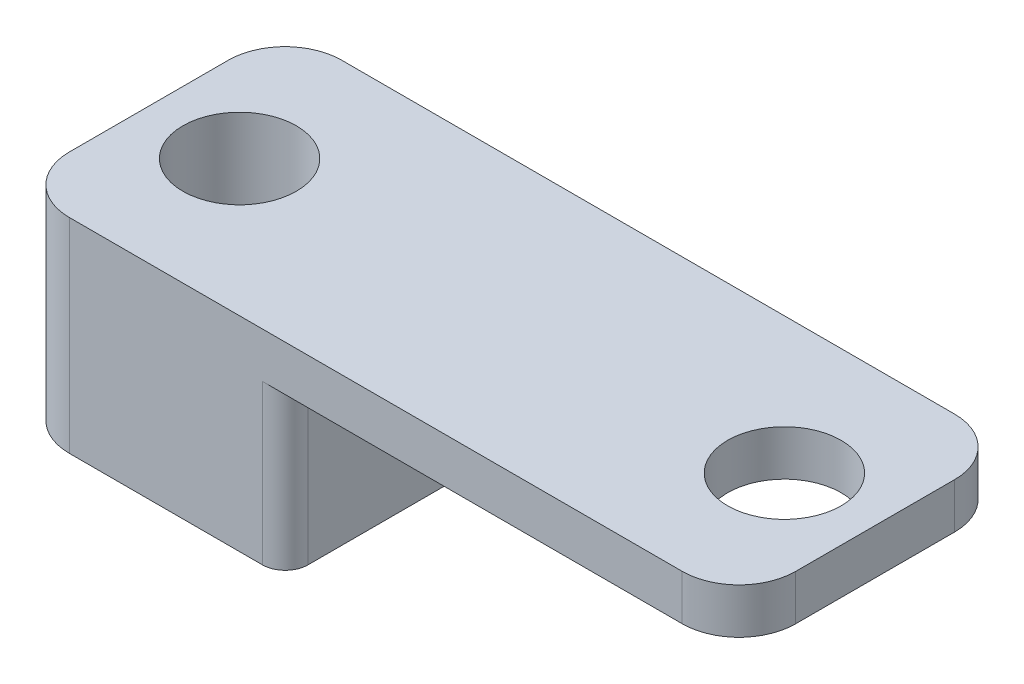
ISO-10303-21;
HEADER;
FILE_DESCRIPTION(('STEP AP214'),'2;1');
FILE_NAME('part.step','',(''),(''),'','','');
FILE_SCHEMA(('AUTOMOTIVE_DESIGN { 1 0 10303 214 1 1 1 1 }'));
ENDSEC;
DATA;
#1=APPLICATION_CONTEXT('core data for automotive mechanical design processes');
#2=APPLICATION_PROTOCOL_DEFINITION('international standard','automotive_design',2000,#1);
#3=PRODUCT_CONTEXT('',#1,'mechanical');
#4=PRODUCT('Part','Part','',(#3));
#5=PRODUCT_RELATED_PRODUCT_CATEGORY('part','',(#4));
#6=PRODUCT_DEFINITION_FORMATION('','',#4);
#7=PRODUCT_DEFINITION_CONTEXT('part definition',#1,'design');
#8=PRODUCT_DEFINITION('design','',#6,#7);
#9=PRODUCT_DEFINITION_SHAPE('','',#8);
#10=(LENGTH_UNIT() NAMED_UNIT(*) SI_UNIT(.MILLI.,.METRE.));
#11=(NAMED_UNIT(*) PLANE_ANGLE_UNIT() SI_UNIT($,.RADIAN.));
#12=(NAMED_UNIT(*) SI_UNIT($,.STERADIAN.) SOLID_ANGLE_UNIT());
#13=UNCERTAINTY_MEASURE_WITH_UNIT(LENGTH_MEASURE(1.E-05),#10,'distance_accuracy_value','');
#14=(GEOMETRIC_REPRESENTATION_CONTEXT(3) GLOBAL_UNCERTAINTY_ASSIGNED_CONTEXT((#13)) GLOBAL_UNIT_ASSIGNED_CONTEXT((#10,
#11,#12)) REPRESENTATION_CONTEXT('',''));
#15=CARTESIAN_POINT('',(0.,0.,0.));
#16=DIRECTION('',(0.,0.,1.));
#17=DIRECTION('',(1.,0.,0.));
#18=AXIS2_PLACEMENT_3D('',#15,#16,#17);
#19=CARTESIAN_POINT('',(-13.5,20.,-6.));
#20=DIRECTION('',(0.,0.,1.));
#21=DIRECTION('',(1.,0.,0.));
#22=AXIS2_PLACEMENT_3D('',#19,#20,#21);
#23=PLANE('',#22);
#24=DIRECTION('',(1.,0.,0.));
#25=VECTOR('',#24,1.);
#26=CARTESIAN_POINT('',(-13.5,18.,-6.));
#27=LINE('',#26,#25);
#28=CARTESIAN_POINT('',(-4.98992888657235,18.,-6.));
#29=VERTEX_POINT('',#28);
#30=CARTESIAN_POINT('',(13.5,18.,-6.));
#31=VERTEX_POINT('',#30);
#32=EDGE_CURVE('E48',#29,#31,#27,.T.);
#33=ORIENTED_EDGE('',*,*,#32,.F.);
#34=DIRECTION('',(0.,-1.,0.));
#35=VECTOR('',#34,1.);
#36=CARTESIAN_POINT('',(-4.98992888657235,20.,-6.));
#37=LINE('',#36,#35);
#38=CARTESIAN_POINT('',(-4.98992888657235,11.,-6.));
#39=VERTEX_POINT('',#38);
#40=EDGE_CURVE('E179',#29,#39,#37,.T.);
#41=ORIENTED_EDGE('',*,*,#40,.T.);
#42=DIRECTION('',(1.,0.,0.));
#43=VECTOR('',#42,1.);
#44=CARTESIAN_POINT('',(-13.5,11.,-6.));
#45=LINE('',#44,#43);
#46=CARTESIAN_POINT('',(-13.5,11.,-6.));
#47=VERTEX_POINT('',#46);
#48=EDGE_CURVE('E249',#47,#39,#45,.T.);
#49=ORIENTED_EDGE('',*,*,#48,.F.);
#50=DIRECTION('',(0.,-1.,0.));
#51=VECTOR('',#50,1.);
#52=CARTESIAN_POINT('',(-13.5,20.,-6.));
#53=LINE('',#52,#51);
#54=CARTESIAN_POINT('',(-13.5,20.,-6.));
#55=VERTEX_POINT('',#54);
#56=EDGE_CURVE('E159',#55,#47,#53,.T.);
#57=ORIENTED_EDGE('',*,*,#56,.F.);
#58=DIRECTION('',(-1.,0.,0.));
#59=VECTOR('',#58,1.);
#60=CARTESIAN_POINT('',(-13.5,20.,-6.));
#61=LINE('',#60,#59);
#62=CARTESIAN_POINT('',(13.5,20.,-6.));
#63=VERTEX_POINT('',#62);
#64=EDGE_CURVE('E227',#63,#55,#61,.T.);
#65=ORIENTED_EDGE('',*,*,#64,.F.);
#66=DIRECTION('',(0.,-1.,0.));
#67=VECTOR('',#66,1.);
#68=CARTESIAN_POINT('',(13.5,20.,-6.));
#69=LINE('',#68,#67);
#70=EDGE_CURVE('E162',#63,#31,#69,.T.);
#71=ORIENTED_EDGE('',*,*,#70,.T.);
#72=EDGE_LOOP('',(#33,#41,#49,#57,#65,#71));
#73=FACE_BOUND('',#72,.T.);
#74=ADVANCED_FACE('F33',(#73),#23,.F.);
#75=CARTESIAN_POINT('',(-13.5,20.,-3.5));
#76=DIRECTION('',(0.,-1.,0.));
#77=DIRECTION('',(0.,0.,-1.));
#78=AXIS2_PLACEMENT_3D('',#75,#76,#77);
#79=CYLINDRICAL_SURFACE('',#78,2.5);
#80=CARTESIAN_POINT('',(-13.5,11.,-3.5));
#81=DIRECTION('',(0.,-1.,0.));
#82=DIRECTION('',(0.,0.,-1.));
#83=AXIS2_PLACEMENT_3D('',#80,#81,#82);
#84=CIRCLE('',#83,2.5);
#85=CARTESIAN_POINT('',(-16.,11.,-3.5));
#86=VERTEX_POINT('',#85);
#87=EDGE_CURVE('E247',#86,#47,#84,.T.);
#88=ORIENTED_EDGE('',*,*,#87,.F.);
#89=DIRECTION('',(0.,-1.,0.));
#90=VECTOR('',#89,1.);
#91=CARTESIAN_POINT('',(-16.,20.,-3.5));
#92=LINE('',#91,#90);
#93=CARTESIAN_POINT('',(-16.,20.,-3.5));
#94=VERTEX_POINT('',#93);
#95=EDGE_CURVE('E150',#94,#86,#92,.T.);
#96=ORIENTED_EDGE('',*,*,#95,.F.);
#97=CARTESIAN_POINT('',(-13.5,20.,-3.5));
#98=DIRECTION('',(0.,1.,0.));
#99=DIRECTION('',(0.,0.,1.));
#100=AXIS2_PLACEMENT_3D('',#97,#98,#99);
#101=CIRCLE('',#100,2.5);
#102=EDGE_CURVE('E236',#55,#94,#101,.T.);
#103=ORIENTED_EDGE('',*,*,#102,.F.);
#104=ORIENTED_EDGE('',*,*,#56,.T.);
#105=EDGE_LOOP('',(#88,#96,#103,#104));
#106=FACE_BOUND('',#105,.T.);
#107=ADVANCED_FACE('F288',(#106),#79,.T.);
#108=CARTESIAN_POINT('',(-16.,20.,-3.5));
#109=DIRECTION('',(1.,0.,0.));
#110=DIRECTION('',(0.,0.,-1.));
#111=AXIS2_PLACEMENT_3D('',#108,#109,#110);
#112=PLANE('',#111);
#113=DIRECTION('',(0.,0.,-1.));
#114=VECTOR('',#113,1.);
#115=CARTESIAN_POINT('',(-16.,11.,-3.5));
#116=LINE('',#115,#114);
#117=CARTESIAN_POINT('',(-16.,11.,3.5));
#118=VERTEX_POINT('',#117);
#119=EDGE_CURVE('E143',#118,#86,#116,.T.);
#120=ORIENTED_EDGE('',*,*,#119,.F.);
#121=DIRECTION('',(0.,-1.,0.));
#122=VECTOR('',#121,1.);
#123=CARTESIAN_POINT('',(-16.,20.,3.5));
#124=LINE('',#123,#122);
#125=CARTESIAN_POINT('',(-16.,20.,3.5));
#126=VERTEX_POINT('',#125);
#127=EDGE_CURVE('E142',#126,#118,#124,.T.);
#128=ORIENTED_EDGE('',*,*,#127,.F.);
#129=DIRECTION('',(0.,0.,1.));
#130=VECTOR('',#129,1.);
#131=CARTESIAN_POINT('',(-16.,20.,-3.5));
#132=LINE('',#131,#130);
#133=EDGE_CURVE('E238',#94,#126,#132,.T.);
#134=ORIENTED_EDGE('',*,*,#133,.F.);
#135=ORIENTED_EDGE('',*,*,#95,.T.);
#136=EDGE_LOOP('',(#120,#128,#134,#135));
#137=FACE_BOUND('',#136,.T.);
#138=ADVANCED_FACE('F245',(#137),#112,.F.);
#139=CARTESIAN_POINT('',(-13.5,20.,3.5));
#140=DIRECTION('',(0.,-1.,0.));
#141=DIRECTION('',(0.,0.,-1.));
#142=AXIS2_PLACEMENT_3D('',#139,#140,#141);
#143=CYLINDRICAL_SURFACE('',#142,2.5);
#144=CARTESIAN_POINT('',(-13.5,11.,3.5));
#145=DIRECTION('',(0.,-1.,0.));
#146=DIRECTION('',(0.,0.,-1.));
#147=AXIS2_PLACEMENT_3D('',#144,#145,#146);
#148=CIRCLE('',#147,2.5);
#149=CARTESIAN_POINT('',(-13.5,11.,6.));
#150=VERTEX_POINT('',#149);
#151=EDGE_CURVE('E125',#150,#118,#148,.T.);
#152=ORIENTED_EDGE('',*,*,#151,.F.);
#153=DIRECTION('',(0.,-1.,0.));
#154=VECTOR('',#153,1.);
#155=CARTESIAN_POINT('',(-13.5,20.,6.));
#156=LINE('',#155,#154);
#157=CARTESIAN_POINT('',(-13.5,20.,6.));
#158=VERTEX_POINT('',#157);
#159=EDGE_CURVE('E139',#158,#150,#156,.T.);
#160=ORIENTED_EDGE('',*,*,#159,.F.);
#161=CARTESIAN_POINT('',(-13.5,20.,3.5));
#162=DIRECTION('',(0.,1.,0.));
#163=DIRECTION('',(0.,0.,1.));
#164=AXIS2_PLACEMENT_3D('',#161,#162,#163);
#165=CIRCLE('',#164,2.5);
#166=EDGE_CURVE('E212',#126,#158,#165,.T.);
#167=ORIENTED_EDGE('',*,*,#166,.F.);
#168=ORIENTED_EDGE('',*,*,#127,.T.);
#169=EDGE_LOOP('',(#152,#160,#167,#168));
#170=FACE_BOUND('',#169,.T.);
#171=ADVANCED_FACE('F137',(#170),#143,.T.);
#172=CARTESIAN_POINT('',(-13.5,20.,6.));
#173=DIRECTION('',(0.,0.,-1.));
#174=DIRECTION('',(-1.,0.,0.));
#175=AXIS2_PLACEMENT_3D('',#172,#173,#174);
#176=PLANE('',#175);
#177=DIRECTION('',(-1.,0.,0.));
#178=VECTOR('',#177,1.);
#179=CARTESIAN_POINT('',(-13.5,11.,6.));
#180=LINE('',#179,#178);
#181=CARTESIAN_POINT('',(-4.98992888657235,11.,6.));
#182=VERTEX_POINT('',#181);
#183=EDGE_CURVE('E121',#182,#150,#180,.T.);
#184=ORIENTED_EDGE('',*,*,#183,.F.);
#185=DIRECTION('',(0.,1.,0.));
#186=VECTOR('',#185,1.);
#187=CARTESIAN_POINT('',(-4.98992888657235,20.,6.));
#188=LINE('',#187,#186);
#189=CARTESIAN_POINT('',(-4.98992888657235,18.,6.));
#190=VERTEX_POINT('',#189);
#191=EDGE_CURVE('E171',#182,#190,#188,.T.);
#192=ORIENTED_EDGE('',*,*,#191,.T.);
#193=DIRECTION('',(-1.,0.,0.));
#194=VECTOR('',#193,1.);
#195=CARTESIAN_POINT('',(-13.5,18.,6.));
#196=LINE('',#195,#194);
#197=CARTESIAN_POINT('',(13.5,18.,6.));
#198=VERTEX_POINT('',#197);
#199=EDGE_CURVE('E187',#198,#190,#196,.T.);
#200=ORIENTED_EDGE('',*,*,#199,.F.);
#201=DIRECTION('',(0.,-1.,0.));
#202=VECTOR('',#201,1.);
#203=CARTESIAN_POINT('',(13.5,20.,6.));
#204=LINE('',#203,#202);
#205=CARTESIAN_POINT('',(13.5,20.,6.));
#206=VERTEX_POINT('',#205);
#207=EDGE_CURVE('E148',#206,#198,#204,.T.);
#208=ORIENTED_EDGE('',*,*,#207,.F.);
#209=DIRECTION('',(1.,0.,0.));
#210=VECTOR('',#209,1.);
#211=CARTESIAN_POINT('',(-13.5,20.,6.));
#212=LINE('',#211,#210);
#213=EDGE_CURVE('E147',#158,#206,#212,.T.);
#214=ORIENTED_EDGE('',*,*,#213,.F.);
#215=ORIENTED_EDGE('',*,*,#159,.T.);
#216=EDGE_LOOP('',(#184,#192,#200,#208,#214,#215));
#217=FACE_BOUND('',#216,.T.);
#218=ADVANCED_FACE('F145',(#217),#176,.F.);
#219=CARTESIAN_POINT('',(-12.,20.,0.));
#220=DIRECTION('',(0.,-1.,0.));
#221=DIRECTION('',(0.,0.,-1.));
#222=AXIS2_PLACEMENT_3D('',#219,#220,#221);
#223=CYLINDRICAL_SURFACE('',#222,2.5);
#224=CARTESIAN_POINT('',(-12.,20.,0.));
#225=DIRECTION('',(0.,1.,0.));
#226=DIRECTION('',(0.,0.,1.));
#227=AXIS2_PLACEMENT_3D('',#224,#225,#226);
#228=CIRCLE('',#227,2.5);
#229=CARTESIAN_POINT('',(-12.,20.,2.5));
#230=VERTEX_POINT('',#229);
#231=EDGE_CURVE('E230',#230,#230,#228,.T.);
#232=ORIENTED_EDGE('',*,*,#231,.T.);
#233=EDGE_LOOP('',(#232));
#234=FACE_BOUND('',#233,.T.);
#235=CARTESIAN_POINT('',(-12.,11.,0.));
#236=DIRECTION('',(0.,-1.,0.));
#237=DIRECTION('',(0.,0.,-1.));
#238=AXIS2_PLACEMENT_3D('',#235,#236,#237);
#239=CIRCLE('',#238,2.5);
#240=CARTESIAN_POINT('',(-12.,11.,-2.5));
#241=VERTEX_POINT('',#240);
#242=EDGE_CURVE('E193',#241,#241,#239,.T.);
#243=ORIENTED_EDGE('',*,*,#242,.T.);
#244=EDGE_LOOP('',(#243));
#245=FACE_BOUND('',#244,.T.);
#246=ADVANCED_FACE('F265',(#234,#245),#223,.F.);
#247=CARTESIAN_POINT('',(-3.98992888657235,18.,-10.1694009134056));
#248=DIRECTION('',(-1.,0.,0.));
#249=DIRECTION('',(0.,0.,1.));
#250=AXIS2_PLACEMENT_3D('',#247,#248,#249);
#251=PLANE('',#250);
#252=DIRECTION('',(0.,0.,-1.));
#253=VECTOR('',#252,1.);
#254=CARTESIAN_POINT('',(-3.98992888657235,18.,-10.1694009134056));
#255=LINE('',#254,#253);
#256=CARTESIAN_POINT('',(-3.98992888657235,18.,5.));
#257=VERTEX_POINT('',#256);
#258=CARTESIAN_POINT('',(-3.98992888657235,18.,-5.));
#259=VERTEX_POINT('',#258);
#260=EDGE_CURVE('E169',#257,#259,#255,.T.);
#261=ORIENTED_EDGE('',*,*,#260,.F.);
#262=DIRECTION('',(0.,1.,0.));
#263=VECTOR('',#262,1.);
#264=CARTESIAN_POINT('',(-3.98992888657235,18.,5.));
#265=LINE('',#264,#263);
#266=CARTESIAN_POINT('',(-3.98992888657235,11.,5.));
#267=VERTEX_POINT('',#266);
#268=EDGE_CURVE('E175',#257,#267,#265,.F.);
#269=ORIENTED_EDGE('',*,*,#268,.T.);
#270=DIRECTION('',(0.,0.,1.));
#271=VECTOR('',#270,1.);
#272=CARTESIAN_POINT('',(-3.98992888657235,11.,-10.1694009134056));
#273=LINE('',#272,#271);
#274=CARTESIAN_POINT('',(-3.98992888657235,11.,-5.));
#275=VERTEX_POINT('',#274);
#276=EDGE_CURVE('E164',#275,#267,#273,.T.);
#277=ORIENTED_EDGE('',*,*,#276,.F.);
#278=DIRECTION('',(0.,-1.,0.));
#279=VECTOR('',#278,1.);
#280=CARTESIAN_POINT('',(-3.98992888657235,18.,-5.));
#281=LINE('',#280,#279);
#282=EDGE_CURVE('E173',#275,#259,#281,.F.);
#283=ORIENTED_EDGE('',*,*,#282,.T.);
#284=EDGE_LOOP('',(#261,#269,#277,#283));
#285=FACE_BOUND('',#284,.T.);
#286=ADVANCED_FACE('F191',(#285),#251,.F.);
#287=CARTESIAN_POINT('',(13.5,20.,-3.5));
#288=DIRECTION('',(0.,-1.,0.));
#289=DIRECTION('',(0.,0.,-1.));
#290=AXIS2_PLACEMENT_3D('',#287,#288,#289);
#291=CYLINDRICAL_SURFACE('',#290,2.5);
#292=CARTESIAN_POINT('',(13.5,18.,-3.5));
#293=DIRECTION('',(0.,-1.,0.));
#294=DIRECTION('',(0.,0.,-1.));
#295=AXIS2_PLACEMENT_3D('',#292,#293,#294);
#296=CIRCLE('',#295,2.5);
#297=CARTESIAN_POINT('',(16.,18.,-3.5));
#298=VERTEX_POINT('',#297);
#299=EDGE_CURVE('E197',#31,#298,#296,.T.);
#300=ORIENTED_EDGE('',*,*,#299,.F.);
#301=ORIENTED_EDGE('',*,*,#70,.F.);
#302=CARTESIAN_POINT('',(13.5,20.,-3.5));
#303=DIRECTION('',(0.,1.,0.));
#304=DIRECTION('',(0.,0.,-1.));
#305=AXIS2_PLACEMENT_3D('',#302,#303,#304);
#306=CIRCLE('',#305,2.5);
#307=CARTESIAN_POINT('',(16.,20.,-3.5));
#308=VERTEX_POINT('',#307);
#309=EDGE_CURVE('E225',#308,#63,#306,.T.);
#310=ORIENTED_EDGE('',*,*,#309,.F.);
#311=DIRECTION('',(0.,-1.,0.));
#312=VECTOR('',#311,1.);
#313=CARTESIAN_POINT('',(16.,20.,-3.5));
#314=LINE('',#313,#312);
#315=EDGE_CURVE('E210',#308,#298,#314,.T.);
#316=ORIENTED_EDGE('',*,*,#315,.T.);
#317=EDGE_LOOP('',(#300,#301,#310,#316));
#318=FACE_BOUND('',#317,.T.);
#319=ADVANCED_FACE('F233',(#318),#291,.T.);
#320=CARTESIAN_POINT('',(13.5,20.,3.5));
#321=DIRECTION('',(0.,-1.,0.));
#322=DIRECTION('',(0.,0.,-1.));
#323=AXIS2_PLACEMENT_3D('',#320,#321,#322);
#324=CYLINDRICAL_SURFACE('',#323,2.5);
#325=CARTESIAN_POINT('',(13.5,18.,3.5));
#326=DIRECTION('',(0.,-1.,0.));
#327=DIRECTION('',(0.,0.,-1.));
#328=AXIS2_PLACEMENT_3D('',#325,#326,#327);
#329=CIRCLE('',#328,2.5);
#330=CARTESIAN_POINT('',(16.,18.,3.5));
#331=VERTEX_POINT('',#330);
#332=EDGE_CURVE('E198',#331,#198,#329,.T.);
#333=ORIENTED_EDGE('',*,*,#332,.F.);
#334=DIRECTION('',(0.,-1.,0.));
#335=VECTOR('',#334,1.);
#336=CARTESIAN_POINT('',(16.,20.,3.5));
#337=LINE('',#336,#335);
#338=CARTESIAN_POINT('',(16.,20.,3.5));
#339=VERTEX_POINT('',#338);
#340=EDGE_CURVE('E153',#339,#331,#337,.T.);
#341=ORIENTED_EDGE('',*,*,#340,.F.);
#342=CARTESIAN_POINT('',(13.5,20.,3.5));
#343=DIRECTION('',(0.,1.,0.));
#344=DIRECTION('',(0.,0.,1.));
#345=AXIS2_PLACEMENT_3D('',#342,#343,#344);
#346=CIRCLE('',#345,2.5);
#347=EDGE_CURVE('E205',#206,#339,#346,.T.);
#348=ORIENTED_EDGE('',*,*,#347,.F.);
#349=ORIENTED_EDGE('',*,*,#207,.T.);
#350=EDGE_LOOP('',(#333,#341,#348,#349));
#351=FACE_BOUND('',#350,.T.);
#352=ADVANCED_FACE('F202',(#351),#324,.T.);
#353=CARTESIAN_POINT('',(16.,20.,-3.5));
#354=DIRECTION('',(-1.,0.,0.));
#355=DIRECTION('',(0.,0.,1.));
#356=AXIS2_PLACEMENT_3D('',#353,#354,#355);
#357=PLANE('',#356);
#358=DIRECTION('',(0.,0.,1.));
#359=VECTOR('',#358,1.);
#360=CARTESIAN_POINT('',(16.,18.,-3.5));
#361=LINE('',#360,#359);
#362=EDGE_CURVE('E168',#298,#331,#361,.T.);
#363=ORIENTED_EDGE('',*,*,#362,.F.);
#364=ORIENTED_EDGE('',*,*,#315,.F.);
#365=DIRECTION('',(0.,0.,-1.));
#366=VECTOR('',#365,1.);
#367=CARTESIAN_POINT('',(16.,20.,-3.5));
#368=LINE('',#367,#366);
#369=EDGE_CURVE('E208',#339,#308,#368,.T.);
#370=ORIENTED_EDGE('',*,*,#369,.F.);
#371=ORIENTED_EDGE('',*,*,#340,.T.);
#372=EDGE_LOOP('',(#363,#364,#370,#371));
#373=FACE_BOUND('',#372,.T.);
#374=ADVANCED_FACE('F219',(#373),#357,.F.);
#375=CARTESIAN_POINT('',(12.,20.,0.));
#376=DIRECTION('',(0.,-1.,0.));
#377=DIRECTION('',(0.,0.,-1.));
#378=AXIS2_PLACEMENT_3D('',#375,#376,#377);
#379=CYLINDRICAL_SURFACE('',#378,2.5);
#380=CARTESIAN_POINT('',(12.,20.,0.));
#381=DIRECTION('',(0.,1.,0.));
#382=DIRECTION('',(0.,0.,1.));
#383=AXIS2_PLACEMENT_3D('',#380,#381,#382);
#384=CIRCLE('',#383,2.5);
#385=CARTESIAN_POINT('',(12.,20.,2.5));
#386=VERTEX_POINT('',#385);
#387=EDGE_CURVE('E260',#386,#386,#384,.T.);
#388=ORIENTED_EDGE('',*,*,#387,.T.);
#389=EDGE_LOOP('',(#388));
#390=FACE_BOUND('',#389,.T.);
#391=CARTESIAN_POINT('',(12.,18.,0.));
#392=DIRECTION('',(0.,-1.,0.));
#393=DIRECTION('',(0.,0.,-1.));
#394=AXIS2_PLACEMENT_3D('',#391,#392,#393);
#395=CIRCLE('',#394,2.5);
#396=CARTESIAN_POINT('',(12.,18.,-2.5));
#397=VERTEX_POINT('',#396);
#398=EDGE_CURVE('E165',#397,#397,#395,.T.);
#399=ORIENTED_EDGE('',*,*,#398,.T.);
#400=EDGE_LOOP('',(#399));
#401=FACE_BOUND('',#400,.T.);
#402=ADVANCED_FACE('F269',(#390,#401),#379,.F.);
#403=CARTESIAN_POINT('',(13.5,20.,-3.5));
#404=DIRECTION('',(0.,-1.,0.));
#405=DIRECTION('',(0.,0.,-1.));
#406=AXIS2_PLACEMENT_3D('',#403,#404,#405);
#407=PLANE('',#406);
#408=ORIENTED_EDGE('',*,*,#309,.T.);
#409=ORIENTED_EDGE('',*,*,#64,.T.);
#410=ORIENTED_EDGE('',*,*,#102,.T.);
#411=ORIENTED_EDGE('',*,*,#133,.T.);
#412=ORIENTED_EDGE('',*,*,#166,.T.);
#413=ORIENTED_EDGE('',*,*,#213,.T.);
#414=ORIENTED_EDGE('',*,*,#347,.T.);
#415=ORIENTED_EDGE('',*,*,#369,.T.);
#416=EDGE_LOOP('',(#408,#409,#410,#411,#412,#413,#414,#415));
#417=FACE_BOUND('',#416,.T.);
#418=ORIENTED_EDGE('',*,*,#231,.F.);
#419=EDGE_LOOP('',(#418));
#420=FACE_BOUND('',#419,.T.);
#421=ORIENTED_EDGE('',*,*,#387,.F.);
#422=EDGE_LOOP('',(#421));
#423=FACE_BOUND('',#422,.T.);
#424=ADVANCED_FACE('F223',(#417,#420,#423),#407,.F.);
#425=CARTESIAN_POINT('',(0.,18.,0.));
#426=DIRECTION('',(0.,-1.,0.));
#427=DIRECTION('',(0.,0.,-1.));
#428=AXIS2_PLACEMENT_3D('',#425,#426,#427);
#429=PLANE('',#428);
#430=ORIENTED_EDGE('',*,*,#398,.F.);
#431=EDGE_LOOP('',(#430));
#432=FACE_BOUND('',#431,.T.);
#433=ORIENTED_EDGE('',*,*,#32,.T.);
#434=ORIENTED_EDGE('',*,*,#299,.T.);
#435=ORIENTED_EDGE('',*,*,#362,.T.);
#436=ORIENTED_EDGE('',*,*,#332,.T.);
#437=ORIENTED_EDGE('',*,*,#199,.T.);
#438=CARTESIAN_POINT('',(-4.98992888657235,18.,5.));
#439=DIRECTION('',(0.,-1.,0.));
#440=DIRECTION('',(0.,0.,-1.));
#441=AXIS2_PLACEMENT_3D('',#438,#439,#440);
#442=CIRCLE('',#441,1.);
#443=EDGE_CURVE('E41',#190,#257,#442,.F.);
#444=ORIENTED_EDGE('',*,*,#443,.T.);
#445=ORIENTED_EDGE('',*,*,#260,.T.);
#446=CARTESIAN_POINT('',(-4.98992888657235,18.,-5.));
#447=DIRECTION('',(0.,-1.,0.));
#448=DIRECTION('',(0.,0.,-1.));
#449=AXIS2_PLACEMENT_3D('',#446,#447,#448);
#450=CIRCLE('',#449,1.);
#451=EDGE_CURVE('E11',#259,#29,#450,.F.);
#452=ORIENTED_EDGE('',*,*,#451,.T.);
#453=EDGE_LOOP('',(#433,#434,#435,#436,#437,#444,#445,#452));
#454=FACE_BOUND('',#453,.T.);
#455=ADVANCED_FACE('F184',(#432,#454),#429,.T.);
#456=CARTESIAN_POINT('',(0.,11.,0.));
#457=DIRECTION('',(0.,-1.,0.));
#458=DIRECTION('',(0.,0.,-1.));
#459=AXIS2_PLACEMENT_3D('',#456,#457,#458);
#460=PLANE('',#459);
#461=ORIENTED_EDGE('',*,*,#242,.F.);
#462=EDGE_LOOP('',(#461));
#463=FACE_BOUND('',#462,.T.);
#464=ORIENTED_EDGE('',*,*,#276,.T.);
#465=CARTESIAN_POINT('',(-4.98992888657235,11.,5.));
#466=DIRECTION('',(0.,-1.,0.));
#467=DIRECTION('',(0.,0.,-1.));
#468=AXIS2_PLACEMENT_3D('',#465,#466,#467);
#469=CIRCLE('',#468,1.);
#470=EDGE_CURVE('E128',#267,#182,#469,.T.);
#471=ORIENTED_EDGE('',*,*,#470,.T.);
#472=ORIENTED_EDGE('',*,*,#183,.T.);
#473=ORIENTED_EDGE('',*,*,#151,.T.);
#474=ORIENTED_EDGE('',*,*,#119,.T.);
#475=ORIENTED_EDGE('',*,*,#87,.T.);
#476=ORIENTED_EDGE('',*,*,#48,.T.);
#477=CARTESIAN_POINT('',(-4.98992888657235,11.,-5.));
#478=DIRECTION('',(0.,-1.,0.));
#479=DIRECTION('',(0.,0.,-1.));
#480=AXIS2_PLACEMENT_3D('',#477,#478,#479);
#481=CIRCLE('',#480,1.);
#482=EDGE_CURVE('E55',#39,#275,#481,.T.);
#483=ORIENTED_EDGE('',*,*,#482,.T.);
#484=EDGE_LOOP('',(#464,#471,#472,#473,#474,#475,#476,#483));
#485=FACE_BOUND('',#484,.T.);
#486=ADVANCED_FACE('F124',(#463,#485),#460,.T.);
#487=CARTESIAN_POINT('',(-4.98992888657235,20.,5.));
#488=DIRECTION('',(0.,1.,0.));
#489=DIRECTION('',(0.,0.,1.));
#490=AXIS2_PLACEMENT_3D('',#487,#488,#489);
#491=CYLINDRICAL_SURFACE('',#490,1.);
#492=ORIENTED_EDGE('',*,*,#470,.F.);
#493=ORIENTED_EDGE('',*,*,#268,.F.);
#494=ORIENTED_EDGE('',*,*,#443,.F.);
#495=ORIENTED_EDGE('',*,*,#191,.F.);
#496=EDGE_LOOP('',(#492,#493,#494,#495));
#497=FACE_BOUND('',#496,.T.);
#498=ADVANCED_FACE('F195',(#497),#491,.T.);
#499=CARTESIAN_POINT('',(-4.98992888657235,20.,-5.));
#500=DIRECTION('',(0.,-1.,0.));
#501=DIRECTION('',(0.,0.,-1.));
#502=AXIS2_PLACEMENT_3D('',#499,#500,#501);
#503=CYLINDRICAL_SURFACE('',#502,1.);
#504=ORIENTED_EDGE('',*,*,#451,.F.);
#505=ORIENTED_EDGE('',*,*,#282,.F.);
#506=ORIENTED_EDGE('',*,*,#482,.F.);
#507=ORIENTED_EDGE('',*,*,#40,.F.);
#508=EDGE_LOOP('',(#504,#505,#506,#507));
#509=FACE_BOUND('',#508,.T.);
#510=ADVANCED_FACE('F35',(#509),#503,.T.);
#511=CLOSED_SHELL('',(#74,#107,#138,#171,#218,#246,#286,#319,#352,#374,#402,#424,#455,#486,#498,#510));
#512=MANIFOLD_SOLID_BREP('B2',#511);
#513=ADVANCED_BREP_SHAPE_REPRESENTATION('',(#18,#512),#14);
#514=SHAPE_DEFINITION_REPRESENTATION(#9,#513);
ENDSEC;
END-ISO-10303-21;
